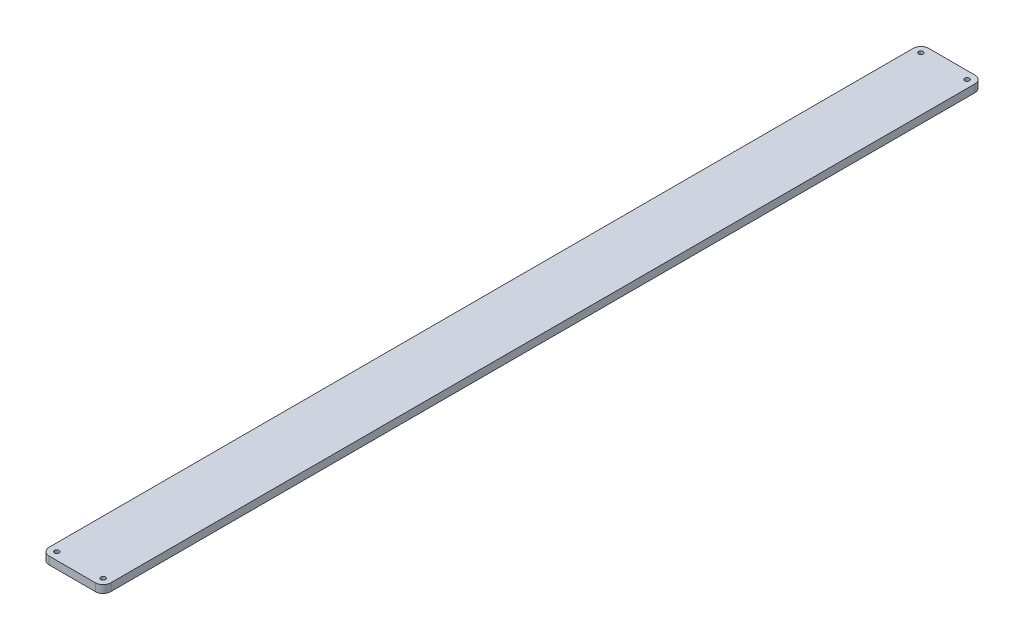
ISO-10303-21;
HEADER;
FILE_DESCRIPTION(('STEP AP214'),'2;1');
FILE_NAME('part.step','',(''),(''),'','','');
FILE_SCHEMA(('AUTOMOTIVE_DESIGN { 1 0 10303 214 1 1 1 1 }'));
ENDSEC;
DATA;
#1=APPLICATION_CONTEXT('core data for automotive mechanical design processes');
#2=APPLICATION_PROTOCOL_DEFINITION('international standard','automotive_design',2000,#1);
#3=PRODUCT_CONTEXT('',#1,'mechanical');
#4=PRODUCT('Part','Part','',(#3));
#5=PRODUCT_RELATED_PRODUCT_CATEGORY('part','',(#4));
#6=PRODUCT_DEFINITION_FORMATION('','',#4);
#7=PRODUCT_DEFINITION_CONTEXT('part definition',#1,'design');
#8=PRODUCT_DEFINITION('design','',#6,#7);
#9=PRODUCT_DEFINITION_SHAPE('','',#8);
#10=(LENGTH_UNIT() NAMED_UNIT(*) SI_UNIT(.MILLI.,.METRE.));
#11=(NAMED_UNIT(*) PLANE_ANGLE_UNIT() SI_UNIT($,.RADIAN.));
#12=(NAMED_UNIT(*) SI_UNIT($,.STERADIAN.) SOLID_ANGLE_UNIT());
#13=UNCERTAINTY_MEASURE_WITH_UNIT(LENGTH_MEASURE(1.E-05),#10,'distance_accuracy_value','');
#14=(GEOMETRIC_REPRESENTATION_CONTEXT(3) GLOBAL_UNCERTAINTY_ASSIGNED_CONTEXT((#13)) GLOBAL_UNIT_ASSIGNED_CONTEXT((#10,
#11,#12)) REPRESENTATION_CONTEXT('',''));
#15=CARTESIAN_POINT('',(0.,0.,0.));
#16=DIRECTION('',(0.,0.,1.));
#17=DIRECTION('',(1.,0.,0.));
#18=AXIS2_PLACEMENT_3D('',#15,#16,#17);
#19=CARTESIAN_POINT('',(0.,5.,0.));
#20=DIRECTION('',(0.,-1.,0.));
#21=DIRECTION('',(0.,0.,-1.));
#22=AXIS2_PLACEMENT_3D('',#19,#20,#21);
#23=PLANE('',#22);
#24=DIRECTION('',(-1.,0.,0.));
#25=VECTOR('',#24,1.);
#26=CARTESIAN_POINT('',(-20.,5.,-285.5));
#27=LINE('',#26,#25);
#28=CARTESIAN_POINT('',(15.,5.,-285.5));
#29=VERTEX_POINT('',#28);
#30=CARTESIAN_POINT('',(-15.,5.,-285.5));
#31=VERTEX_POINT('',#30);
#32=EDGE_CURVE('E168',#29,#31,#27,.T.);
#33=ORIENTED_EDGE('',*,*,#32,.T.);
#34=CARTESIAN_POINT('',(-15.,5.,-280.5));
#35=DIRECTION('',(0.,-1.,0.));
#36=DIRECTION('',(0.,0.,-1.));
#37=AXIS2_PLACEMENT_3D('',#34,#35,#36);
#38=CIRCLE('',#37,5.);
#39=CARTESIAN_POINT('',(-20.,5.,-280.5));
#40=VERTEX_POINT('',#39);
#41=EDGE_CURVE('E148',#31,#40,#38,.F.);
#42=ORIENTED_EDGE('',*,*,#41,.T.);
#43=DIRECTION('',(0.,0.,1.));
#44=VECTOR('',#43,1.);
#45=CARTESIAN_POINT('',(-19.9999999999999,5.,285.5));
#46=LINE('',#45,#44);
#47=CARTESIAN_POINT('',(-19.9999999999999,5.,280.5));
#48=VERTEX_POINT('',#47);
#49=EDGE_CURVE('E118',#40,#48,#46,.T.);
#50=ORIENTED_EDGE('',*,*,#49,.T.);
#51=CARTESIAN_POINT('',(-14.9999999999999,5.,280.5));
#52=DIRECTION('',(0.,-1.,0.));
#53=DIRECTION('',(0.,0.,-1.));
#54=AXIS2_PLACEMENT_3D('',#51,#52,#53);
#55=CIRCLE('',#54,5.);
#56=CARTESIAN_POINT('',(-14.9999999999999,5.,285.5));
#57=VERTEX_POINT('',#56);
#58=EDGE_CURVE('E54',#48,#57,#55,.F.);
#59=ORIENTED_EDGE('',*,*,#58,.T.);
#60=DIRECTION('',(1.,0.,0.));
#61=VECTOR('',#60,1.);
#62=CARTESIAN_POINT('',(-19.9999999999999,5.,285.5));
#63=LINE('',#62,#61);
#64=CARTESIAN_POINT('',(15.,5.,285.5));
#65=VERTEX_POINT('',#64);
#66=EDGE_CURVE('E135',#57,#65,#63,.T.);
#67=ORIENTED_EDGE('',*,*,#66,.T.);
#68=CARTESIAN_POINT('',(15.,5.,280.5));
#69=DIRECTION('',(0.,-1.,0.));
#70=DIRECTION('',(0.,0.,-1.));
#71=AXIS2_PLACEMENT_3D('',#68,#69,#70);
#72=CIRCLE('',#71,5.);
#73=CARTESIAN_POINT('',(20.,5.,280.5));
#74=VERTEX_POINT('',#73);
#75=EDGE_CURVE('E143',#65,#74,#72,.F.);
#76=ORIENTED_EDGE('',*,*,#75,.T.);
#77=DIRECTION('',(0.,0.,-1.));
#78=VECTOR('',#77,1.);
#79=CARTESIAN_POINT('',(20.,5.,285.5));
#80=LINE('',#79,#78);
#81=CARTESIAN_POINT('',(20.,5.,-280.5));
#82=VERTEX_POINT('',#81);
#83=EDGE_CURVE('E129',#74,#82,#80,.T.);
#84=ORIENTED_EDGE('',*,*,#83,.T.);
#85=CARTESIAN_POINT('',(15.,5.,-280.5));
#86=DIRECTION('',(0.,-1.,0.));
#87=DIRECTION('',(0.,0.,-1.));
#88=AXIS2_PLACEMENT_3D('',#85,#86,#87);
#89=CIRCLE('',#88,5.);
#90=EDGE_CURVE('E146',#82,#29,#89,.F.);
#91=ORIENTED_EDGE('',*,*,#90,.T.);
#92=EDGE_LOOP('',(#33,#42,#50,#59,#67,#76,#84,#91));
#93=FACE_BOUND('',#92,.T.);
#94=CARTESIAN_POINT('',(15.,5.,-280.5));
#95=DIRECTION('',(0.,1.,0.));
#96=DIRECTION('',(0.,0.,1.));
#97=AXIS2_PLACEMENT_3D('',#94,#95,#96);
#98=CIRCLE('',#97,1.5);
#99=CARTESIAN_POINT('',(15.,5.,-279.));
#100=VERTEX_POINT('',#99);
#101=EDGE_CURVE('E174',#100,#100,#98,.T.);
#102=ORIENTED_EDGE('',*,*,#101,.F.);
#103=EDGE_LOOP('',(#102));
#104=FACE_BOUND('',#103,.T.);
#105=CARTESIAN_POINT('',(-15.,5.,-280.5));
#106=DIRECTION('',(0.,1.,0.));
#107=DIRECTION('',(0.,0.,-1.));
#108=AXIS2_PLACEMENT_3D('',#105,#106,#107);
#109=CIRCLE('',#108,1.5);
#110=CARTESIAN_POINT('',(-15.,5.,-282.));
#111=VERTEX_POINT('',#110);
#112=EDGE_CURVE('E183',#111,#111,#109,.T.);
#113=ORIENTED_EDGE('',*,*,#112,.F.);
#114=EDGE_LOOP('',(#113));
#115=FACE_BOUND('',#114,.T.);
#116=CARTESIAN_POINT('',(-15.,5.,280.5));
#117=DIRECTION('',(0.,1.,0.));
#118=DIRECTION('',(0.,0.,1.));
#119=AXIS2_PLACEMENT_3D('',#116,#117,#118);
#120=CIRCLE('',#119,1.5);
#121=CARTESIAN_POINT('',(-15.,5.,282.));
#122=VERTEX_POINT('',#121);
#123=EDGE_CURVE('E188',#122,#122,#120,.T.);
#124=ORIENTED_EDGE('',*,*,#123,.F.);
#125=EDGE_LOOP('',(#124));
#126=FACE_BOUND('',#125,.T.);
#127=CARTESIAN_POINT('',(15.,5.,280.5));
#128=DIRECTION('',(0.,1.,0.));
#129=DIRECTION('',(0.,0.,-1.));
#130=AXIS2_PLACEMENT_3D('',#127,#128,#129);
#131=CIRCLE('',#130,1.5);
#132=CARTESIAN_POINT('',(15.,5.,279.));
#133=VERTEX_POINT('',#132);
#134=EDGE_CURVE('E194',#133,#133,#131,.T.);
#135=ORIENTED_EDGE('',*,*,#134,.F.);
#136=EDGE_LOOP('',(#135));
#137=FACE_BOUND('',#136,.T.);
#138=ADVANCED_FACE('F33',(#93,#104,#115,#126,#137),#23,.F.);
#139=CARTESIAN_POINT('',(0.,0.,0.));
#140=DIRECTION('',(0.,-1.,0.));
#141=DIRECTION('',(0.,0.,-1.));
#142=AXIS2_PLACEMENT_3D('',#139,#140,#141);
#143=PLANE('',#142);
#144=CARTESIAN_POINT('',(-15.,0.,280.5));
#145=DIRECTION('',(0.,1.,0.));
#146=DIRECTION('',(0.,0.,1.));
#147=AXIS2_PLACEMENT_3D('',#144,#145,#146);
#148=CIRCLE('',#147,1.5);
#149=CARTESIAN_POINT('',(-15.,0.,282.));
#150=VERTEX_POINT('',#149);
#151=EDGE_CURVE('E191',#150,#150,#148,.T.);
#152=ORIENTED_EDGE('',*,*,#151,.T.);
#153=EDGE_LOOP('',(#152));
#154=FACE_BOUND('',#153,.T.);
#155=CARTESIAN_POINT('',(15.,0.,-280.5));
#156=DIRECTION('',(0.,1.,0.));
#157=DIRECTION('',(0.,0.,1.));
#158=AXIS2_PLACEMENT_3D('',#155,#156,#157);
#159=CIRCLE('',#158,1.5);
#160=CARTESIAN_POINT('',(15.,0.,-279.));
#161=VERTEX_POINT('',#160);
#162=EDGE_CURVE('E176',#161,#161,#159,.T.);
#163=ORIENTED_EDGE('',*,*,#162,.T.);
#164=EDGE_LOOP('',(#163));
#165=FACE_BOUND('',#164,.T.);
#166=DIRECTION('',(0.,0.,1.));
#167=VECTOR('',#166,1.);
#168=CARTESIAN_POINT('',(-19.9999999999999,0.,285.5));
#169=LINE('',#168,#167);
#170=CARTESIAN_POINT('',(-20.,0.,-280.5));
#171=VERTEX_POINT('',#170);
#172=CARTESIAN_POINT('',(-19.9999999999999,0.,280.5));
#173=VERTEX_POINT('',#172);
#174=EDGE_CURVE('E116',#171,#173,#169,.T.);
#175=ORIENTED_EDGE('',*,*,#174,.F.);
#176=CARTESIAN_POINT('',(-15.,0.,-280.5));
#177=DIRECTION('',(0.,-1.,0.));
#178=DIRECTION('',(0.,0.,-1.));
#179=AXIS2_PLACEMENT_3D('',#176,#177,#178);
#180=CIRCLE('',#179,5.);
#181=CARTESIAN_POINT('',(-15.,0.,-285.5));
#182=VERTEX_POINT('',#181);
#183=EDGE_CURVE('E99',#171,#182,#180,.T.);
#184=ORIENTED_EDGE('',*,*,#183,.T.);
#185=DIRECTION('',(-1.,0.,0.));
#186=VECTOR('',#185,1.);
#187=CARTESIAN_POINT('',(-20.,0.,-285.5));
#188=LINE('',#187,#186);
#189=CARTESIAN_POINT('',(15.,0.,-285.5));
#190=VERTEX_POINT('',#189);
#191=EDGE_CURVE('E127',#190,#182,#188,.T.);
#192=ORIENTED_EDGE('',*,*,#191,.F.);
#193=CARTESIAN_POINT('',(15.,0.,-280.5));
#194=DIRECTION('',(0.,-1.,0.));
#195=DIRECTION('',(0.,0.,-1.));
#196=AXIS2_PLACEMENT_3D('',#193,#194,#195);
#197=CIRCLE('',#196,5.);
#198=CARTESIAN_POINT('',(20.,0.,-280.5));
#199=VERTEX_POINT('',#198);
#200=EDGE_CURVE('E110',#190,#199,#197,.T.);
#201=ORIENTED_EDGE('',*,*,#200,.T.);
#202=DIRECTION('',(0.,0.,-1.));
#203=VECTOR('',#202,1.);
#204=CARTESIAN_POINT('',(20.,0.,285.5));
#205=LINE('',#204,#203);
#206=CARTESIAN_POINT('',(20.,0.,280.5));
#207=VERTEX_POINT('',#206);
#208=EDGE_CURVE('E131',#207,#199,#205,.T.);
#209=ORIENTED_EDGE('',*,*,#208,.F.);
#210=CARTESIAN_POINT('',(15.,0.,280.5));
#211=DIRECTION('',(0.,-1.,0.));
#212=DIRECTION('',(0.,0.,-1.));
#213=AXIS2_PLACEMENT_3D('',#210,#211,#212);
#214=CIRCLE('',#213,5.);
#215=CARTESIAN_POINT('',(15.,0.,285.5));
#216=VERTEX_POINT('',#215);
#217=EDGE_CURVE('E119',#207,#216,#214,.T.);
#218=ORIENTED_EDGE('',*,*,#217,.T.);
#219=DIRECTION('',(1.,0.,0.));
#220=VECTOR('',#219,1.);
#221=CARTESIAN_POINT('',(-19.9999999999999,0.,285.5));
#222=LINE('',#221,#220);
#223=CARTESIAN_POINT('',(-14.9999999999999,0.,285.5));
#224=VERTEX_POINT('',#223);
#225=EDGE_CURVE('E126',#224,#216,#222,.T.);
#226=ORIENTED_EDGE('',*,*,#225,.F.);
#227=CARTESIAN_POINT('',(-14.9999999999999,0.,280.5));
#228=DIRECTION('',(0.,-1.,0.));
#229=DIRECTION('',(0.,0.,-1.));
#230=AXIS2_PLACEMENT_3D('',#227,#228,#229);
#231=CIRCLE('',#230,5.);
#232=EDGE_CURVE('E125',#224,#173,#231,.T.);
#233=ORIENTED_EDGE('',*,*,#232,.T.);
#234=EDGE_LOOP('',(#175,#184,#192,#201,#209,#218,#226,#233));
#235=FACE_BOUND('',#234,.T.);
#236=CARTESIAN_POINT('',(-15.,0.,-280.5));
#237=DIRECTION('',(0.,1.,0.));
#238=DIRECTION('',(0.,0.,-1.));
#239=AXIS2_PLACEMENT_3D('',#236,#237,#238);
#240=CIRCLE('',#239,1.5);
#241=CARTESIAN_POINT('',(-15.,0.,-282.));
#242=VERTEX_POINT('',#241);
#243=EDGE_CURVE('E185',#242,#242,#240,.T.);
#244=ORIENTED_EDGE('',*,*,#243,.T.);
#245=EDGE_LOOP('',(#244));
#246=FACE_BOUND('',#245,.T.);
#247=CARTESIAN_POINT('',(15.,0.,280.5));
#248=DIRECTION('',(0.,1.,0.));
#249=DIRECTION('',(0.,0.,-1.));
#250=AXIS2_PLACEMENT_3D('',#247,#248,#249);
#251=CIRCLE('',#250,1.5);
#252=CARTESIAN_POINT('',(15.,0.,279.));
#253=VERTEX_POINT('',#252);
#254=EDGE_CURVE('E197',#253,#253,#251,.T.);
#255=ORIENTED_EDGE('',*,*,#254,.T.);
#256=EDGE_LOOP('',(#255));
#257=FACE_BOUND('',#256,.T.);
#258=ADVANCED_FACE('F122',(#154,#165,#235,#246,#257),#143,.T.);
#259=CARTESIAN_POINT('',(20.,5.,285.5));
#260=DIRECTION('',(-1.,0.,0.));
#261=DIRECTION('',(0.,0.,1.));
#262=AXIS2_PLACEMENT_3D('',#259,#260,#261);
#263=PLANE('',#262);
#264=ORIENTED_EDGE('',*,*,#208,.T.);
#265=DIRECTION('',(0.,-1.,0.));
#266=VECTOR('',#265,1.);
#267=CARTESIAN_POINT('',(20.,5.,-280.5));
#268=LINE('',#267,#266);
#269=EDGE_CURVE('E153',#199,#82,#268,.F.);
#270=ORIENTED_EDGE('',*,*,#269,.T.);
#271=ORIENTED_EDGE('',*,*,#83,.F.);
#272=DIRECTION('',(0.,-1.,0.));
#273=VECTOR('',#272,1.);
#274=CARTESIAN_POINT('',(20.,5.,280.5));
#275=LINE('',#274,#273);
#276=EDGE_CURVE('E150',#74,#207,#275,.T.);
#277=ORIENTED_EDGE('',*,*,#276,.T.);
#278=EDGE_LOOP('',(#264,#270,#271,#277));
#279=FACE_BOUND('',#278,.T.);
#280=ADVANCED_FACE('F159',(#279),#263,.F.);
#281=CARTESIAN_POINT('',(-20.,5.,-285.5));
#282=DIRECTION('',(0.,0.,1.));
#283=DIRECTION('',(1.,0.,0.));
#284=AXIS2_PLACEMENT_3D('',#281,#282,#283);
#285=PLANE('',#284);
#286=ORIENTED_EDGE('',*,*,#191,.T.);
#287=DIRECTION('',(0.,-1.,0.));
#288=VECTOR('',#287,1.);
#289=CARTESIAN_POINT('',(-15.,5.,-285.5));
#290=LINE('',#289,#288);
#291=EDGE_CURVE('E104',#182,#31,#290,.F.);
#292=ORIENTED_EDGE('',*,*,#291,.T.);
#293=ORIENTED_EDGE('',*,*,#32,.F.);
#294=DIRECTION('',(0.,-1.,0.));
#295=VECTOR('',#294,1.);
#296=CARTESIAN_POINT('',(15.,5.,-285.5));
#297=LINE('',#296,#295);
#298=EDGE_CURVE('E109',#29,#190,#297,.T.);
#299=ORIENTED_EDGE('',*,*,#298,.T.);
#300=EDGE_LOOP('',(#286,#292,#293,#299));
#301=FACE_BOUND('',#300,.T.);
#302=ADVANCED_FACE('F173',(#301),#285,.F.);
#303=CARTESIAN_POINT('',(-19.9999999999999,5.,285.5));
#304=DIRECTION('',(1.,0.,0.));
#305=DIRECTION('',(0.,0.,-1.));
#306=AXIS2_PLACEMENT_3D('',#303,#304,#305);
#307=PLANE('',#306);
#308=ORIENTED_EDGE('',*,*,#49,.F.);
#309=DIRECTION('',(0.,-1.,0.));
#310=VECTOR('',#309,1.);
#311=CARTESIAN_POINT('',(-20.,5.,-280.5));
#312=LINE('',#311,#310);
#313=EDGE_CURVE('E103',#40,#171,#312,.T.);
#314=ORIENTED_EDGE('',*,*,#313,.T.);
#315=ORIENTED_EDGE('',*,*,#174,.T.);
#316=DIRECTION('',(0.,-1.,0.));
#317=VECTOR('',#316,1.);
#318=CARTESIAN_POINT('',(-19.9999999999999,5.,280.5));
#319=LINE('',#318,#317);
#320=EDGE_CURVE('E120',#173,#48,#319,.F.);
#321=ORIENTED_EDGE('',*,*,#320,.T.);
#322=EDGE_LOOP('',(#308,#314,#315,#321));
#323=FACE_BOUND('',#322,.T.);
#324=ADVANCED_FACE('F115',(#323),#307,.F.);
#325=CARTESIAN_POINT('',(-19.9999999999999,5.,285.5));
#326=DIRECTION('',(0.,0.,-1.));
#327=DIRECTION('',(-1.,0.,0.));
#328=AXIS2_PLACEMENT_3D('',#325,#326,#327);
#329=PLANE('',#328);
#330=ORIENTED_EDGE('',*,*,#66,.F.);
#331=DIRECTION('',(0.,-1.,0.));
#332=VECTOR('',#331,1.);
#333=CARTESIAN_POINT('',(-14.9999999999999,5.,285.5));
#334=LINE('',#333,#332);
#335=EDGE_CURVE('E11',#57,#224,#334,.T.);
#336=ORIENTED_EDGE('',*,*,#335,.T.);
#337=ORIENTED_EDGE('',*,*,#225,.T.);
#338=DIRECTION('',(0.,-1.,0.));
#339=VECTOR('',#338,1.);
#340=CARTESIAN_POINT('',(15.,5.,285.5));
#341=LINE('',#340,#339);
#342=EDGE_CURVE('E41',#216,#65,#341,.F.);
#343=ORIENTED_EDGE('',*,*,#342,.T.);
#344=EDGE_LOOP('',(#330,#336,#337,#343));
#345=FACE_BOUND('',#344,.T.);
#346=ADVANCED_FACE('F217',(#345),#329,.F.);
#347=CARTESIAN_POINT('',(15.,5.,-280.5));
#348=DIRECTION('',(0.,-1.,0.));
#349=DIRECTION('',(0.,0.,-1.));
#350=AXIS2_PLACEMENT_3D('',#347,#348,#349);
#351=CYLINDRICAL_SURFACE('',#350,1.5);
#352=ORIENTED_EDGE('',*,*,#101,.T.);
#353=EDGE_LOOP('',(#352));
#354=FACE_BOUND('',#353,.T.);
#355=ORIENTED_EDGE('',*,*,#162,.F.);
#356=EDGE_LOOP('',(#355));
#357=FACE_BOUND('',#356,.T.);
#358=ADVANCED_FACE('F214',(#354,#357),#351,.F.);
#359=CARTESIAN_POINT('',(-15.,5.,-280.5));
#360=DIRECTION('',(0.,-1.,0.));
#361=DIRECTION('',(0.,0.,-1.));
#362=AXIS2_PLACEMENT_3D('',#359,#360,#361);
#363=CYLINDRICAL_SURFACE('',#362,1.5);
#364=ORIENTED_EDGE('',*,*,#112,.T.);
#365=EDGE_LOOP('',(#364));
#366=FACE_BOUND('',#365,.T.);
#367=ORIENTED_EDGE('',*,*,#243,.F.);
#368=EDGE_LOOP('',(#367));
#369=FACE_BOUND('',#368,.T.);
#370=ADVANCED_FACE('F309',(#366,#369),#363,.F.);
#371=CARTESIAN_POINT('',(-15.,5.,280.5));
#372=DIRECTION('',(0.,-1.,0.));
#373=DIRECTION('',(0.,0.,-1.));
#374=AXIS2_PLACEMENT_3D('',#371,#372,#373);
#375=CYLINDRICAL_SURFACE('',#374,1.5);
#376=ORIENTED_EDGE('',*,*,#123,.T.);
#377=EDGE_LOOP('',(#376));
#378=FACE_BOUND('',#377,.T.);
#379=ORIENTED_EDGE('',*,*,#151,.F.);
#380=EDGE_LOOP('',(#379));
#381=FACE_BOUND('',#380,.T.);
#382=ADVANCED_FACE('F300',(#378,#381),#375,.F.);
#383=CARTESIAN_POINT('',(15.,5.,280.5));
#384=DIRECTION('',(0.,-1.,0.));
#385=DIRECTION('',(0.,0.,-1.));
#386=AXIS2_PLACEMENT_3D('',#383,#384,#385);
#387=CYLINDRICAL_SURFACE('',#386,1.5);
#388=ORIENTED_EDGE('',*,*,#134,.T.);
#389=EDGE_LOOP('',(#388));
#390=FACE_BOUND('',#389,.T.);
#391=ORIENTED_EDGE('',*,*,#254,.F.);
#392=EDGE_LOOP('',(#391));
#393=FACE_BOUND('',#392,.T.);
#394=ADVANCED_FACE('F203',(#390,#393),#387,.F.);
#395=CARTESIAN_POINT('',(-15.,5.,-280.5));
#396=DIRECTION('',(0.,-1.,0.));
#397=DIRECTION('',(0.,0.,-1.));
#398=AXIS2_PLACEMENT_3D('',#395,#396,#397);
#399=CYLINDRICAL_SURFACE('',#398,5.);
#400=ORIENTED_EDGE('',*,*,#41,.F.);
#401=ORIENTED_EDGE('',*,*,#291,.F.);
#402=ORIENTED_EDGE('',*,*,#183,.F.);
#403=ORIENTED_EDGE('',*,*,#313,.F.);
#404=EDGE_LOOP('',(#400,#401,#402,#403));
#405=FACE_BOUND('',#404,.T.);
#406=ADVANCED_FACE('F102',(#405),#399,.T.);
#407=CARTESIAN_POINT('',(15.,5.,-280.5));
#408=DIRECTION('',(0.,-1.,0.));
#409=DIRECTION('',(0.,0.,-1.));
#410=AXIS2_PLACEMENT_3D('',#407,#408,#409);
#411=CYLINDRICAL_SURFACE('',#410,5.);
#412=ORIENTED_EDGE('',*,*,#90,.F.);
#413=ORIENTED_EDGE('',*,*,#269,.F.);
#414=ORIENTED_EDGE('',*,*,#200,.F.);
#415=ORIENTED_EDGE('',*,*,#298,.F.);
#416=EDGE_LOOP('',(#412,#413,#414,#415));
#417=FACE_BOUND('',#416,.T.);
#418=ADVANCED_FACE('F171',(#417),#411,.T.);
#419=CARTESIAN_POINT('',(-14.9999999999999,5.,280.5));
#420=DIRECTION('',(0.,-1.,0.));
#421=DIRECTION('',(0.,0.,-1.));
#422=AXIS2_PLACEMENT_3D('',#419,#420,#421);
#423=CYLINDRICAL_SURFACE('',#422,5.);
#424=ORIENTED_EDGE('',*,*,#58,.F.);
#425=ORIENTED_EDGE('',*,*,#320,.F.);
#426=ORIENTED_EDGE('',*,*,#232,.F.);
#427=ORIENTED_EDGE('',*,*,#335,.F.);
#428=EDGE_LOOP('',(#424,#425,#426,#427));
#429=FACE_BOUND('',#428,.T.);
#430=ADVANCED_FACE('F229',(#429),#423,.T.);
#431=CARTESIAN_POINT('',(15.,5.,280.5));
#432=DIRECTION('',(0.,-1.,0.));
#433=DIRECTION('',(0.,0.,-1.));
#434=AXIS2_PLACEMENT_3D('',#431,#432,#433);
#435=CYLINDRICAL_SURFACE('',#434,5.);
#436=ORIENTED_EDGE('',*,*,#75,.F.);
#437=ORIENTED_EDGE('',*,*,#342,.F.);
#438=ORIENTED_EDGE('',*,*,#217,.F.);
#439=ORIENTED_EDGE('',*,*,#276,.F.);
#440=EDGE_LOOP('',(#436,#437,#438,#439));
#441=FACE_BOUND('',#440,.T.);
#442=ADVANCED_FACE('F35',(#441),#435,.T.);
#443=CLOSED_SHELL('',(#138,#258,#280,#302,#324,#346,#358,#370,#382,#394,#406,#418,#430,#442));
#444=MANIFOLD_SOLID_BREP('B2',#443);
#445=ADVANCED_BREP_SHAPE_REPRESENTATION('',(#18,#444),#14);
#446=SHAPE_DEFINITION_REPRESENTATION(#9,#445);
ENDSEC;
END-ISO-10303-21;
